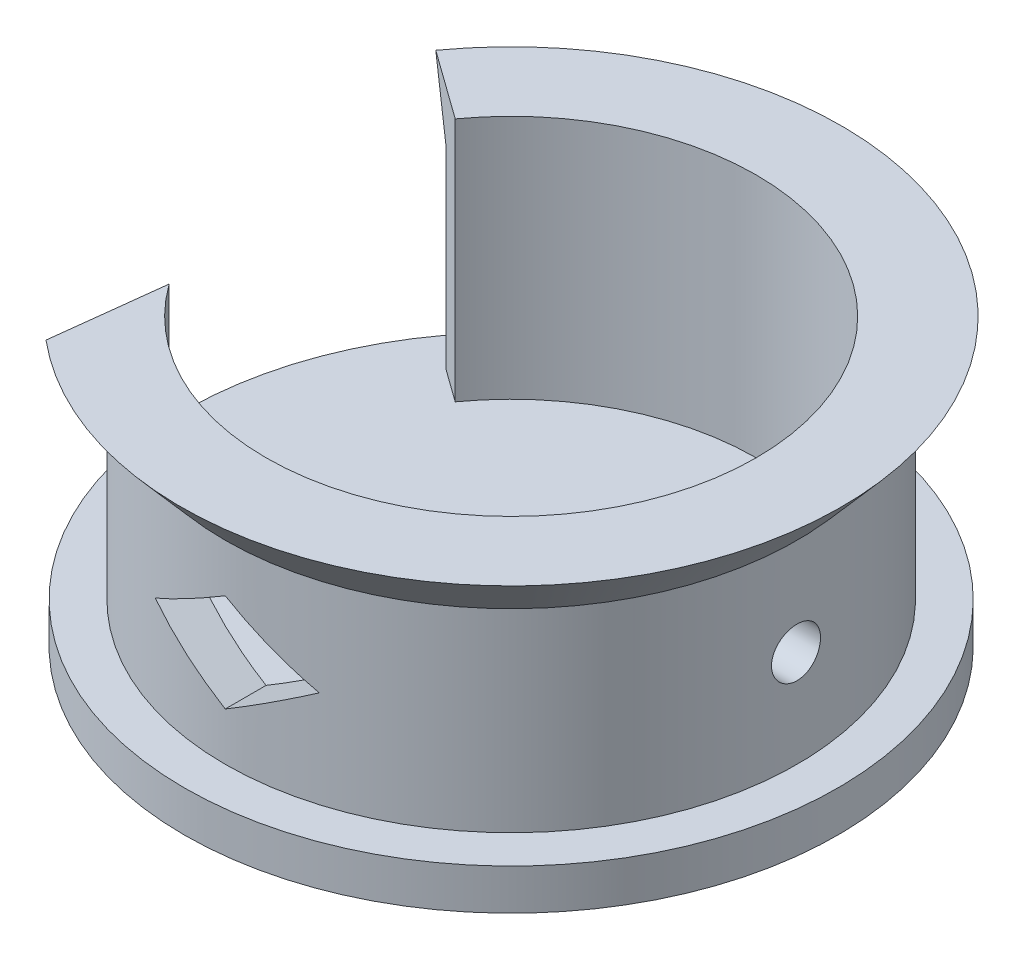
ISO-10303-21;
HEADER;
FILE_DESCRIPTION(('STEP AP214'),'2;1');
FILE_NAME('part.step','',(''),(''),'','','');
FILE_SCHEMA(('AUTOMOTIVE_DESIGN { 1 0 10303 214 1 1 1 1 }'));
ENDSEC;
DATA;
#1=APPLICATION_CONTEXT('core data for automotive mechanical design processes');
#2=APPLICATION_PROTOCOL_DEFINITION('international standard','automotive_design',2000,#1);
#3=PRODUCT_CONTEXT('',#1,'mechanical');
#4=PRODUCT('Part','Part','',(#3));
#5=PRODUCT_RELATED_PRODUCT_CATEGORY('part','',(#4));
#6=PRODUCT_DEFINITION_FORMATION('','',#4);
#7=PRODUCT_DEFINITION_CONTEXT('part definition',#1,'design');
#8=PRODUCT_DEFINITION('design','',#6,#7);
#9=PRODUCT_DEFINITION_SHAPE('','',#8);
#10=(LENGTH_UNIT() NAMED_UNIT(*) SI_UNIT(.MILLI.,.METRE.));
#11=(NAMED_UNIT(*) PLANE_ANGLE_UNIT() SI_UNIT($,.RADIAN.));
#12=(NAMED_UNIT(*) SI_UNIT($,.STERADIAN.) SOLID_ANGLE_UNIT());
#13=UNCERTAINTY_MEASURE_WITH_UNIT(LENGTH_MEASURE(1.E-05),#10,'distance_accuracy_value','');
#14=(GEOMETRIC_REPRESENTATION_CONTEXT(3) GLOBAL_UNCERTAINTY_ASSIGNED_CONTEXT((#13)) GLOBAL_UNIT_ASSIGNED_CONTEXT((#10,
#11,#12)) REPRESENTATION_CONTEXT('',''));
#15=CARTESIAN_POINT('',(0.,0.,0.));
#16=DIRECTION('',(0.,0.,1.));
#17=DIRECTION('',(1.,0.,0.));
#18=AXIS2_PLACEMENT_3D('',#15,#16,#17);
#19=CARTESIAN_POINT('',(0.,5.75,0.));
#20=DIRECTION('',(0.,-1.,0.));
#21=DIRECTION('',(0.,0.,-1.));
#22=AXIS2_PLACEMENT_3D('',#19,#20,#21);
#23=CYLINDRICAL_SURFACE('',#22,6.);
#24=CARTESIAN_POINT('',(0.,1.,0.));
#25=DIRECTION('',(0.,1.,0.));
#26=DIRECTION('',(0.,0.,1.));
#27=AXIS2_PLACEMENT_3D('',#24,#25,#26);
#28=CIRCLE('',#27,6.);
#29=CARTESIAN_POINT('',(-4.87186168856094,1.00000000000002,-3.50213701724137));
#30=VERTEX_POINT('',#29);
#31=CARTESIAN_POINT('',(-4.87186168856094,1.00000000000002,3.50213701724137));
#32=VERTEX_POINT('',#31);
#33=EDGE_CURVE('E140',#30,#32,#28,.F.);
#34=ORIENTED_EDGE('',*,*,#33,.T.);
#35=DIRECTION('',(0.,1.,0.));
#36=VECTOR('',#35,1.);
#37=CARTESIAN_POINT('',(-4.87186168856094,1.00000000000002,3.50213701724137));
#38=LINE('',#37,#36);
#39=CARTESIAN_POINT('',(-4.87186168856093,7.00000000000002,3.50213701724137));
#40=VERTEX_POINT('',#39);
#41=EDGE_CURVE('E144',#32,#40,#38,.T.);
#42=ORIENTED_EDGE('',*,*,#41,.T.);
#43=CARTESIAN_POINT('',(0.,7.00000000000001,0.));
#44=DIRECTION('',(0.,-1.,0.));
#45=DIRECTION('',(1.,0.,0.));
#46=AXIS2_PLACEMENT_3D('',#43,#44,#45);
#47=CIRCLE('',#46,6.);
#48=CARTESIAN_POINT('',(-4.87186168856093,7.00000000000002,-3.50213701724137));
#49=VERTEX_POINT('',#48);
#50=EDGE_CURVE('E142',#49,#40,#47,.T.);
#51=ORIENTED_EDGE('',*,*,#50,.F.);
#52=DIRECTION('',(0.,1.,0.));
#53=VECTOR('',#52,1.);
#54=CARTESIAN_POINT('',(-4.87186168856094,1.00000000000002,-3.50213701724137));
#55=LINE('',#54,#53);
#56=EDGE_CURVE('E70',#30,#49,#55,.T.);
#57=ORIENTED_EDGE('',*,*,#56,.F.);
#58=EDGE_LOOP('',(#34,#42,#51,#57));
#59=FACE_BOUND('',#58,.T.);
#60=CARTESIAN_POINT('',(0.,4.575,0.));
#61=DIRECTION('',(-0.512699186120159,0.858568310940793,0.));
#62=DIRECTION('',(-0.858568310940793,-0.512699186120159,0.));
#63=AXIS2_PLACEMENT_3D('',#60,#61,#62);
#64=ELLIPSE('',#63,6.98837812150949,6.);
#65=CARTESIAN_POINT('',(-2.00952527528977,3.375,5.65347752874031));
#66=VERTEX_POINT('',#65);
#67=CARTESIAN_POINT('',(0.,4.575,6.));
#68=VERTEX_POINT('',#67);
#69=EDGE_CURVE('E198',#66,#68,#64,.T.);
#70=ORIENTED_EDGE('',*,*,#69,.F.);
#71=CARTESIAN_POINT('',(0.,2.175,0.));
#72=DIRECTION('',(0.512699186120159,0.858568310940793,0.));
#73=DIRECTION('',(0.858568310940793,-0.512699186120159,0.));
#74=AXIS2_PLACEMENT_3D('',#71,#72,#73);
#75=ELLIPSE('',#74,6.98837812150949,6.);
#76=CARTESIAN_POINT('',(0.,2.175,6.));
#77=VERTEX_POINT('',#76);
#78=EDGE_CURVE('E208',#66,#77,#75,.T.);
#79=ORIENTED_EDGE('',*,*,#78,.T.);
#80=CARTESIAN_POINT('',(0.,2.175,0.));
#81=DIRECTION('',(-0.512457658614343,0.858712494451726,0.));
#82=DIRECTION('',(-0.858712494451726,-0.512457658614343,0.));
#83=AXIS2_PLACEMENT_3D('',#80,#81,#82);
#84=ELLIPSE('',#83,6.98720472657255,6.);
#85=CARTESIAN_POINT('',(2.00781679805383,3.3732137233419,5.65408451523789));
#86=VERTEX_POINT('',#85);
#87=EDGE_CURVE('E204',#77,#86,#84,.T.);
#88=ORIENTED_EDGE('',*,*,#87,.T.);
#89=CARTESIAN_POINT('',(0.,4.575,0.));
#90=DIRECTION('',(0.513583008999661,0.858039913329709,0.));
#91=DIRECTION('',(0.858039913329709,-0.513583008999661,0.));
#92=AXIS2_PLACEMENT_3D('',#89,#90,#91);
#93=ELLIPSE('',#92,6.99268170022115,6.);
#94=EDGE_CURVE('E201',#68,#86,#93,.T.);
#95=ORIENTED_EDGE('',*,*,#94,.F.);
#96=EDGE_LOOP('',(#70,#79,#88,#95));
#97=FACE_BOUND('',#96,.T.);
#98=CARTESIAN_POINT('',(5.96992462263972,3.375,0.6));
#99=CARTESIAN_POINT('',(5.96992501678142,3.34138826149584,0.599998544036107));
#100=CARTESIAN_POINT('',(5.97021154196531,3.3077542989529,0.597166115389485));
#101=CARTESIAN_POINT('',(5.97132652534872,3.24141888822388,0.585909788858137));
#102=CARTESIAN_POINT('',(5.97215558076732,3.20871850917751,0.577479728931861));
#103=CARTESIAN_POINT('',(5.97426079828433,3.14522050846926,0.555276069641356));
#104=CARTESIAN_POINT('',(5.97553668928074,3.11442174636514,0.541505709776339));
#105=CARTESIAN_POINT('',(5.97839148343092,3.05557932462495,0.50901856043466));
#106=CARTESIAN_POINT('',(5.97997032638597,3.02753511930977,0.490302753375555));
#107=CARTESIAN_POINT('',(5.98325956025939,2.9748892418055,0.448382857199222));
#108=CARTESIAN_POINT('',(5.9849703600316,2.95029899429773,0.425164450864955));
#109=CARTESIAN_POINT('',(5.98832703141431,2.90535743459786,0.374929029191738));
#110=CARTESIAN_POINT('',(5.98997290005128,2.88500631635621,0.347911840143941));
#111=CARTESIAN_POINT('',(5.99301829893363,2.84908124579571,0.290775816990592));
#112=CARTESIAN_POINT('',(5.99441730536788,2.8335174007238,0.260650597517741));
#113=CARTESIAN_POINT('',(5.99680690125462,2.80767334011079,0.198197990572506));
#114=CARTESIAN_POINT('',(5.99779750066238,2.79739299577832,0.165870656800931));
#115=CARTESIAN_POINT('',(5.99925579942616,2.78244125438805,0.100046869645769));
#116=CARTESIAN_POINT('',(5.9997252470569,2.77775110035003,0.0665547162189482));
#117=CARTESIAN_POINT('',(6.00009429359215,2.77405483851977,-0.000744444413366362));
#118=CARTESIAN_POINT('',(5.99999390727164,2.77504858335224,-0.0345514434326772));
#119=CARTESIAN_POINT('',(5.99923602786711,2.78267668359009,-0.101393306438736));
#120=CARTESIAN_POINT('',(5.99858052691028,2.78929086933833,-0.134430497960988));
#121=CARTESIAN_POINT('',(5.99678837558958,2.80794067736797,-0.19892350770272));
#122=CARTESIAN_POINT('',(5.99565171897572,2.81997637007254,-0.230379305374637));
#123=CARTESIAN_POINT('',(5.99302162490349,2.84914965795266,-0.290880188807752));
#124=CARTESIAN_POINT('',(5.99152756419455,2.86629617851809,-0.31992094258899));
#125=CARTESIAN_POINT('',(5.98835030711644,2.90519791400182,-0.374720107904516));
#126=CARTESIAN_POINT('',(5.98666710520087,2.92695326408711,-0.400478423136497));
#127=CARTESIAN_POINT('',(5.98329176080711,2.97456853770819,-0.448099663093614));
#128=CARTESIAN_POINT('',(5.98159961143817,3.00044600684495,-0.469945047714207));
#129=CARTESIAN_POINT('',(5.97840443956933,3.05551011912647,-0.508984521214751));
#130=CARTESIAN_POINT('',(5.97690141734379,3.08469676707129,-0.526178603347734));
#131=CARTESIAN_POINT('',(5.9742545370849,3.14556421511988,-0.555427310743938));
#132=CARTESIAN_POINT('',(5.97311075479533,3.17724553945373,-0.567480852343776));
#133=CARTESIAN_POINT('',(5.97131341122563,3.24219636276881,-0.586092441382554));
#134=CARTESIAN_POINT('',(5.97065983501061,3.27546581333247,-0.59265065624582));
#135=CARTESIAN_POINT('',(5.9699194831645,3.34249450771771,-0.600062865235176));
#136=CARTESIAN_POINT('',(5.96983026928562,3.3762510121589,-0.600941397988327));
#137=CARTESIAN_POINT('',(5.97022230812863,3.44343075949372,-0.597033748122817));
#138=CARTESIAN_POINT('',(5.97070355314237,3.47685400688422,-0.592247642045852));
#139=CARTESIAN_POINT('',(5.97218006653441,3.54234694936701,-0.577167104704512));
#140=CARTESIAN_POINT('',(5.97317425200807,3.5744193426568,-0.566884276313345));
#141=CARTESIAN_POINT('',(5.97556374623277,3.63638403103818,-0.541114031805564));
#142=CARTESIAN_POINT('',(5.97695906417202,3.66627627617231,-0.525626496470153));
#143=CARTESIAN_POINT('',(5.97999950613428,3.72314398441727,-0.48982500085393));
#144=CARTESIAN_POINT('',(5.98164546488803,3.75010916517975,-0.469494779904414));
#145=CARTESIAN_POINT('',(5.98499899575112,3.80025303196444,-0.424608320070704));
#146=CARTESIAN_POINT('',(5.9867065693852,3.82343162420405,-0.400051976548881));
#147=CARTESIAN_POINT('',(5.98999828709581,3.86542898003886,-0.347303882535884));
#148=CARTESIAN_POINT('',(5.99158196433285,3.88423173575173,-0.319099353581671));
#149=CARTESIAN_POINT('',(5.99444065263978,3.91683352110385,-0.259918630450278));
#150=CARTESIAN_POINT('',(5.99571566793895,3.93063261930426,-0.228942474257775));
#151=CARTESIAN_POINT('',(5.99781126248403,3.9528082605932,-0.165153675859689));
#152=CARTESIAN_POINT('',(5.99863265163389,3.96119447239513,-0.132344422589975));
#153=CARTESIAN_POINT('',(5.99973176768189,3.97233784174791,-0.0657748883902072));
#154=CARTESIAN_POINT('',(6.00000950985938,3.97509515750042,-0.0320146342153302));
#155=CARTESIAN_POINT('',(5.99999002987962,3.97490024013603,0.0353413344454483));
#156=CARTESIAN_POINT('',(5.99969531026002,3.97197285789801,0.0689371243347171));
#157=CARTESIAN_POINT('',(5.99856896146555,3.96054375260581,0.135157133013818));
#158=CARTESIAN_POINT('',(5.99773733186924,3.95204202517622,0.16778135104102));
#159=CARTESIAN_POINT('',(5.99563034288377,3.92971244556424,0.231131945260646));
#160=CARTESIAN_POINT('',(5.99435504401949,3.9158853198395,0.261858579646517));
#161=CARTESIAN_POINT('',(5.99150287449778,3.88330009864981,0.320558760092878));
#162=CARTESIAN_POINT('',(5.98992600560493,3.86454203203733,0.348532322261136));
#163=CARTESIAN_POINT('',(5.98663910801433,3.82253422858575,0.401059634656163));
#164=CARTESIAN_POINT('',(5.9849285487642,3.79926599025312,0.425598555731604));
#165=CARTESIAN_POINT('',(5.98157154461795,3.74893478907273,0.470434655635885));
#166=CARTESIAN_POINT('',(5.97992511520666,3.72187091689855,0.490730815108709));
#167=CARTESIAN_POINT('',(5.97687830046361,3.66464139484805,0.526545984254432));
#168=CARTESIAN_POINT('',(5.97547855155184,3.63446803120557,0.542052712796901));
#169=CARTESIAN_POINT('',(5.97309116857477,3.57195102525226,0.567758824859261));
#170=CARTESIAN_POINT('',(5.97210306992016,3.53960987764457,0.577964194733915));
#171=CARTESIAN_POINT('',(5.97090004522887,3.48507135546053,0.590233013000118));
#172=CARTESIAN_POINT('',(5.97053599161417,3.46322264921614,0.593890627438935));
#173=CARTESIAN_POINT('',(5.97004815106598,3.41925250617447,0.598774595163068));
#174=CARTESIAN_POINT('',(5.96992436312391,3.39713107052244,0.600000958654358));
#175=CARTESIAN_POINT('',(5.96992462263972,3.375,0.6));
#176=B_SPLINE_CURVE_WITH_KNOTS('',3,(#98,#99,#100,#101,#102,#103,#104,#105,#106,#107,#108,#109,
#110,#111,#112,#113,#114,#115,#116,#117,#118,#119,#120,#121,#122,#123,#124,#125,#126,#127,#128,
#129,#130,#131,#132,#133,#134,#135,#136,#137,#138,#139,#140,#141,#142,#143,#144,#145,#146,#147,
#148,#149,#150,#151,#152,#153,#154,#155,#156,#157,#158,#159,#160,#161,#162,#163,#164,#165,#166,
#167,#168,#169,#170,#171,#172,#173,#174,#175),.UNSPECIFIED.,.T.,.F.,(4,2,2,2,2,2,2,2,2,2,2,2,2,
2,2,2,2,2,2,2,2,2,2,2,2,2,2,2,2,2,2,2,2,2,2,2,2,2,4),(0.,0.100754396661877,0.201619891093062,
0.302424294598484,0.403208688252789,0.504318969179551,0.605433875131518,0.70676081982775,
0.808085294446769,0.909068825390698,1.01004973798939,1.11066979091197,1.21129115088585,
1.31208927279848,1.41289035131117,1.51413255051001,1.61537489656538,1.7166385747076,
1.8178991675702,1.91872197784659,2.01954342580122,2.12015288822716,2.22076465536628,
2.32171913887031,2.42267612233922,2.52399682090871,2.62531613110803,2.72645395616617,
2.82758893867889,2.9282828008109,3.02897674197995,3.12965695197148,3.23033657286479,
3.33143829022793,3.43256427020715,3.53394744642286,3.635215889364,3.70155616563628,
3.76789616342289),.UNSPECIFIED.);
#177=CARTESIAN_POINT('',(5.96992462263972,3.375,0.6));
#178=VERTEX_POINT('',#177);
#179=EDGE_CURVE('E275',#178,#178,#176,.T.);
#180=ORIENTED_EDGE('',*,*,#179,.T.);
#181=EDGE_LOOP('',(#180));
#182=FACE_BOUND('',#181,.T.);
#183=ADVANCED_FACE('F47',(#59,#97,#182),#23,.F.);
#184=CARTESIAN_POINT('',(0.,5.75,0.));
#185=DIRECTION('',(0.,-1.,0.));
#186=DIRECTION('',(0.,0.,-1.));
#187=AXIS2_PLACEMENT_3D('',#184,#185,#186);
#188=CYLINDRICAL_SURFACE('',#187,7.);
#189=CARTESIAN_POINT('',(0.,2.175,0.));
#190=DIRECTION('',(0.512699186120159,0.858568310940793,0.));
#191=DIRECTION('',(0.858568310940793,-0.512699186120159,0.));
#192=AXIS2_PLACEMENT_3D('',#189,#190,#191);
#193=ELLIPSE('',#192,8.15310780842774,7.);
#194=CARTESIAN_POINT('',(-2.00952527528977,3.375,6.70535667716279));
#195=VERTEX_POINT('',#194);
#196=CARTESIAN_POINT('',(0.,2.175,7.));
#197=VERTEX_POINT('',#196);
#198=EDGE_CURVE('E11',#195,#197,#193,.T.);
#199=ORIENTED_EDGE('',*,*,#198,.F.);
#200=CARTESIAN_POINT('',(0.,4.575,0.));
#201=DIRECTION('',(-0.512699186120159,0.858568310940793,0.));
#202=DIRECTION('',(-0.858568310940793,-0.512699186120159,0.));
#203=AXIS2_PLACEMENT_3D('',#200,#201,#202);
#204=ELLIPSE('',#203,8.15310780842774,7.);
#205=CARTESIAN_POINT('',(0.,4.575,7.));
#206=VERTEX_POINT('',#205);
#207=EDGE_CURVE('E150',#195,#206,#204,.T.);
#208=ORIENTED_EDGE('',*,*,#207,.T.);
#209=CARTESIAN_POINT('',(0.,4.575,0.));
#210=DIRECTION('',(0.513583008999661,0.858039913329709,0.));
#211=DIRECTION('',(0.858039913329709,-0.513583008999661,0.));
#212=AXIS2_PLACEMENT_3D('',#209,#210,#211);
#213=ELLIPSE('',#212,8.15812865025801,7.);
#214=CARTESIAN_POINT('',(2.00781679805383,3.3732137233419,6.70586845273995));
#215=VERTEX_POINT('',#214);
#216=EDGE_CURVE('E156',#206,#215,#213,.T.);
#217=ORIENTED_EDGE('',*,*,#216,.T.);
#218=CARTESIAN_POINT('',(0.,2.175,0.));
#219=DIRECTION('',(-0.512457658614343,0.858712494451726,0.));
#220=DIRECTION('',(-0.858712494451726,-0.512457658614343,0.));
#221=AXIS2_PLACEMENT_3D('',#218,#219,#220);
#222=ELLIPSE('',#221,8.15173884766797,7.);
#223=EDGE_CURVE('E62',#197,#215,#222,.T.);
#224=ORIENTED_EDGE('',*,*,#223,.F.);
#225=EDGE_LOOP('',(#199,#208,#217,#224));
#226=FACE_BOUND('',#225,.T.);
#227=DIRECTION('',(0.,-1.,0.));
#228=VECTOR('',#227,1.);
#229=CARTESIAN_POINT('',(-5.03344359826685,5.75000000000001,4.86461155109701));
#230=LINE('',#229,#228);
#231=CARTESIAN_POINT('',(-5.03344359826686,1.00000000000002,4.864611551097));
#232=VERTEX_POINT('',#231);
#233=CARTESIAN_POINT('',(-5.03344359826685,5.75000000000001,4.864611551097));
#234=VERTEX_POINT('',#233);
#235=EDGE_CURVE('E223',#232,#234,#230,.F.);
#236=ORIENTED_EDGE('',*,*,#235,.F.);
#237=CARTESIAN_POINT('',(0.,1.,0.));
#238=DIRECTION('',(0.,1.,0.));
#239=DIRECTION('',(0.,0.,1.));
#240=AXIS2_PLACEMENT_3D('',#237,#238,#239);
#241=CIRCLE('',#240,7.);
#242=CARTESIAN_POINT('',(-5.68383863665442,1.00000000000002,-4.08582652011493));
#243=VERTEX_POINT('',#242);
#244=EDGE_CURVE('E212',#232,#243,#241,.T.);
#245=ORIENTED_EDGE('',*,*,#244,.T.);
#246=DIRECTION('',(0.,-1.,0.));
#247=VECTOR('',#246,1.);
#248=CARTESIAN_POINT('',(-5.68383863665442,5.75,-4.08582652011493));
#249=LINE('',#248,#247);
#250=CARTESIAN_POINT('',(-5.6838386366544,5.75,-4.08582652011492));
#251=VERTEX_POINT('',#250);
#252=EDGE_CURVE('E126',#243,#251,#249,.F.);
#253=ORIENTED_EDGE('',*,*,#252,.T.);
#254=CARTESIAN_POINT('',(0.,5.75,0.));
#255=DIRECTION('',(0.,1.,0.));
#256=DIRECTION('',(0.,0.,1.));
#257=AXIS2_PLACEMENT_3D('',#254,#255,#256);
#258=CIRCLE('',#257,7.);
#259=EDGE_CURVE('E213',#234,#251,#258,.T.);
#260=ORIENTED_EDGE('',*,*,#259,.F.);
#261=EDGE_LOOP('',(#236,#245,#253,#260));
#262=FACE_BOUND('',#261,.T.);
#263=CARTESIAN_POINT('',(6.97423830966508,3.375,0.6));
#264=CARTESIAN_POINT('',(6.97423865050198,3.34136422044062,0.599998532191382));
#265=CARTESIAN_POINT('',(6.97448426067236,3.3077056288827,0.597162069016927));
#266=CARTESIAN_POINT('',(6.97544013724554,3.2413199857784,0.58588877543727));
#267=CARTESIAN_POINT('',(6.97615092822969,3.20859402948925,0.577445622246808));
#268=CARTESIAN_POINT('',(6.97795607392502,3.14504473670388,0.555205150599323));
#269=CARTESIAN_POINT('',(6.97905020916325,3.11422032338354,0.541410895281653));
#270=CARTESIAN_POINT('',(6.98149848792009,3.05533164026386,0.508865295562401));
#271=CARTESIAN_POINT('',(6.98285257635673,3.02726678763778,0.490115000988515));
#272=CARTESIAN_POINT('',(6.98567230566408,2.97461063579823,0.448134761409391));
#273=CARTESIAN_POINT('',(6.98713820670956,2.95002784330141,0.424894162861934));
#274=CARTESIAN_POINT('',(6.99001401138104,2.90510673285285,0.374615607691181));
#275=CARTESIAN_POINT('',(6.99142391254333,2.88476860147826,0.347577484232283));
#276=CARTESIAN_POINT('',(6.99403134119404,2.84888566072442,0.290420434095021));
#277=CARTESIAN_POINT('',(6.99522854016106,2.83334823921848,0.260296853079579));
#278=CARTESIAN_POINT('',(6.99727286484041,2.80755502527813,0.197856430546741));
#279=CARTESIAN_POINT('',(6.99811999699635,2.79729913562669,0.165539629412293));
#280=CARTESIAN_POINT('',(6.99936691977831,2.78238467511817,0.0997150108437553));
#281=CARTESIAN_POINT('',(6.99976781301671,2.77771230581927,0.0662103410602788));
#282=CARTESIAN_POINT('',(7.00008082663033,2.77405485661757,-0.00110990337436471));
#283=CARTESIAN_POINT('',(6.99999295656777,2.77506966545003,-0.0349254719301429));
#284=CARTESIAN_POINT('',(6.99933925293461,2.78274649220578,-0.101814038368266));
#285=CARTESIAN_POINT('',(6.99877467522766,2.78939367207671,-0.134888753201486));
#286=CARTESIAN_POINT('',(6.99723249568234,2.8081234742478,-0.199451301211187));
#287=CARTESIAN_POINT('',(6.99625488972166,2.82020615079813,-0.2309391185458));
#288=CARTESIAN_POINT('',(6.99399446507932,2.84948046542979,-0.291481205340836));
#289=CARTESIAN_POINT('',(6.99271125046074,2.86667873837216,-0.32053225122166));
#290=CARTESIAN_POINT('',(6.98998378570925,2.90569123243934,-0.375340959953433));
#291=CARTESIAN_POINT('',(6.98853953211796,2.92750555270436,-0.40109855205084));
#292=CARTESIAN_POINT('',(6.98564678702227,2.97521451768241,-0.448675966498289));
#293=CARTESIAN_POINT('',(6.98419829682428,3.00112205764632,-0.470482860093789));
#294=CARTESIAN_POINT('',(6.98146499899432,3.056237132769,-0.509439947528273));
#295=CARTESIAN_POINT('',(6.98018019150891,3.08544467088263,-0.526590137197567));
#296=CARTESIAN_POINT('',(6.97791951064548,3.14633983822835,-0.555746550258746));
#297=CARTESIAN_POINT('',(6.97694367857873,3.17802779839721,-0.567752085865083));
#298=CARTESIAN_POINT('',(6.97541224928428,3.24297989772501,-0.586268738900132));
#299=CARTESIAN_POINT('',(6.97485664270227,3.27624400178114,-0.592779978633399));
#300=CARTESIAN_POINT('',(6.97423010563689,3.34329096190162,-0.600106807995548));
#301=CARTESIAN_POINT('',(6.97415764029966,3.37707183316524,-0.600940434574179));
#302=CARTESIAN_POINT('',(6.97450153962461,3.44429283370313,-0.596935637614893));
#303=CARTESIAN_POINT('',(6.9749178994589,3.47773296633941,-0.59209727009639));
#304=CARTESIAN_POINT('',(6.97619113692522,3.54327136103621,-0.576900872354879));
#305=CARTESIAN_POINT('',(6.97704734153463,3.57537159242294,-0.56655127418532));
#306=CARTESIAN_POINT('',(6.97910323965732,3.63738000777893,-0.540634779065117));
#307=CARTESIAN_POINT('',(6.98030293899553,3.6672881545644,-0.525067793638129));
#308=CARTESIAN_POINT('',(6.98291437122899,3.72414591360165,-0.489112832938145));
#309=CARTESIAN_POINT('',(6.98432662911675,3.75108790627859,-0.468712847076803));
#310=CARTESIAN_POINT('',(6.98720228515176,3.80117152897648,-0.423688295092805));
#311=CARTESIAN_POINT('',(6.98866568422922,3.8243130898271,-0.399063652095302));
#312=CARTESIAN_POINT('',(6.99148331285524,3.86620059457686,-0.346210805462419));
#313=CARTESIAN_POINT('',(6.99283724504033,3.8849348130874,-0.317973291060347));
#314=CARTESIAN_POINT('',(6.99527909640083,3.91739535434427,-0.258742599750699));
#315=CARTESIAN_POINT('',(6.99636701836653,3.93112172962063,-0.227749451752719));
#316=CARTESIAN_POINT('',(6.99815290478386,3.95315684174168,-0.163929146903477));
#317=CARTESIAN_POINT('',(6.99885138935736,3.96147280707219,-0.131104500958708));
#318=CARTESIAN_POINT('',(6.99978181554919,3.97247466027645,-0.0645185921587533));
#319=CARTESIAN_POINT('',(7.00001376656141,3.97516066151237,-0.0307573481763139));
#320=CARTESIAN_POINT('',(6.99998500301097,3.97482498357256,0.0366278741621123));
#321=CARTESIAN_POINT('',(6.99972586492781,3.97182156840343,0.0702519456792062));
#322=CARTESIAN_POINT('',(6.99874715617902,3.96023042817147,0.136516227387567));
#323=CARTESIAN_POINT('',(6.99802758491834,3.95164269589165,0.169156436307264));
#324=CARTESIAN_POINT('',(6.99620873029123,3.92913139562464,0.232527461746223));
#325=CARTESIAN_POINT('',(6.99510947231955,3.91520818448561,0.263258405801466));
#326=CARTESIAN_POINT('',(6.99265416475346,3.88242322307355,0.321949620369786));
#327=CARTESIAN_POINT('',(6.99129811887973,3.86356154435394,0.349909931018465));
#328=CARTESIAN_POINT('',(6.98847621508332,3.82136648769183,0.402359692036196));
#329=CARTESIAN_POINT('',(6.98701003323353,3.79801957722547,0.426838238244782));
#330=CARTESIAN_POINT('',(6.98413586298733,3.74754164145598,0.471539381309728));
#331=CARTESIAN_POINT('',(6.98272788875213,3.72040970224384,0.491760947335169));
#332=CARTESIAN_POINT('',(6.98012656413373,3.66307626699873,0.527403187095964));
#333=CARTESIAN_POINT('',(6.97893363983408,3.63286885870416,0.54281437313527));
#334=CARTESIAN_POINT('',(6.97690266150886,3.5703053554479,0.568326093206933));
#335=CARTESIAN_POINT('',(6.97606420072176,3.53795177292674,0.578432717678778));
#336=CARTESIAN_POINT('',(6.9750521697075,3.48367358438416,0.590481445162075));
#337=CARTESIAN_POINT('',(6.97474838045614,3.46209780857621,0.594046140889055));
#338=CARTESIAN_POINT('',(6.974341340033,3.41868456261859,0.598805891588021));
#339=CARTESIAN_POINT('',(6.97423808828488,3.39684709322121,0.600000953370254));
#340=CARTESIAN_POINT('',(6.97423830966508,3.375,0.6));
#341=B_SPLINE_CURVE_WITH_KNOTS('',3,(#263,#264,#265,#266,#267,#268,#269,#270,#271,#272,#273,
#274,#275,#276,#277,#278,#279,#280,#281,#282,#283,#284,#285,#286,#287,#288,#289,#290,#291,#292,
#293,#294,#295,#296,#297,#298,#299,#300,#301,#302,#303,#304,#305,#306,#307,#308,#309,#310,#311,
#312,#313,#314,#315,#316,#317,#318,#319,#320,#321,#322,#323,#324,#325,#326,#327,#328,#329,#330,
#331,#332,#333,#334,#335,#336,#337,#338,#339,#340),.UNSPECIFIED.,.T.,.F.,(4,2,2,2,2,2,2,2,2,2,2,
2,2,2,2,2,2,2,2,2,2,2,2,2,2,2,2,2,2,2,2,2,2,2,2,2,2,2,4),(0.,0.100827569030982,0.20176903702508,
0.302652808007393,0.403515226088538,0.504619952546395,0.605729122200141,0.706993123841379,
0.808255261451726,0.909266631014318,1.01027602438332,1.11102014057921,1.21176526229627,
1.31264162312537,1.41352015072578,1.51472306642927,1.61592607275123,1.7171426046213,
1.81835688332375,1.91924946840776,2.02014105703519,2.12087872554718,2.22161810245286,
2.32261050463772,2.42360474474666,2.52486470809704,2.62612360924548,2.72724694583426,
2.82836824623393,2.92916547984925,3.02996284373197,3.13075346724919,3.23154263049244,
3.33264080406711,3.43376343055138,3.53508426285377,3.63628850761122,3.70177816355235,
3.76726763127819),.UNSPECIFIED.);
#342=CARTESIAN_POINT('',(6.97423830966508,3.375,0.6));
#343=VERTEX_POINT('',#342);
#344=EDGE_CURVE('E51',#343,#343,#341,.T.);
#345=ORIENTED_EDGE('',*,*,#344,.F.);
#346=EDGE_LOOP('',(#345));
#347=FACE_BOUND('',#346,.T.);
#348=ADVANCED_FACE('F220',(#226,#262,#347),#188,.T.);
#349=CARTESIAN_POINT('',(0.,5.75000000000001,0.));
#350=DIRECTION('',(0.,1.,0.));
#351=DIRECTION('',(-1.,0.,0.));
#352=AXIS2_PLACEMENT_3D('',#349,#350,#351);
#353=CONICAL_SURFACE('',#352,7.,0.714729516755305);
#354=CARTESIAN_POINT('',(0.,7.00000000000001,0.));
#355=DIRECTION('',(0.,-1.,0.));
#356=DIRECTION('',(1.,0.,0.));
#357=AXIS2_PLACEMENT_3D('',#354,#355,#356);
#358=CIRCLE('',#357,8.08473241004738);
#359=CARTESIAN_POINT('',(-6.56461634846278,7.00000000000002,-4.71897344128633));
#360=VERTEX_POINT('',#359);
#361=CARTESIAN_POINT('',(-5.19153456591552,7.00000000000002,6.19765011863165));
#362=VERTEX_POINT('',#361);
#363=EDGE_CURVE('E178',#360,#362,#358,.T.);
#364=ORIENTED_EDGE('',*,*,#363,.T.);
#365=CARTESIAN_POINT('',(-5.19155898957352,7.0002,6.19785606131489));
#366=CARTESIAN_POINT('',(-5.1785956675273,6.89405181640053,6.08854805651235));
#367=CARTESIAN_POINT('',(-5.16558727684558,6.78829854867479,5.97886002854845));
#368=CARTESIAN_POINT('',(-5.13946871893408,6.57772276031978,5.75862578277043));
#369=CARTESIAN_POINT('',(-5.12635856108251,6.47290015579096,5.64807964403439));
#370=CARTESIAN_POINT('',(-5.10002221990802,6.26430522212049,5.42600902839129));
#371=CARTESIAN_POINT('',(-5.08679603436251,6.16053291318029,5.31448453274318));
#372=CARTESIAN_POINT('',(-5.0602103789017,5.95420647364656,5.09031167454926));
#373=CARTESIAN_POINT('',(-5.04685089694052,5.85165245501742,4.97766321043135));
#374=CARTESIAN_POINT('',(-5.03341721718184,5.74980000000004,4.86438910319696));
#375=B_SPLINE_CURVE_WITH_KNOTS('',3,(#365,#366,#367,#368,#369,#370,#371,#372,#373,#374),
.UNSPECIFIED.,.F.,.F.,(4,2,2,2,4),(0.,0.458753046960311,0.917464308484695,1.37618437618866,
1.8349462804219),.UNSPECIFIED.);
#376=EDGE_CURVE('E227',#362,#234,#375,.T.);
#377=ORIENTED_EDGE('',*,*,#376,.T.);
#378=ORIENTED_EDGE('',*,*,#259,.T.);
#379=DIRECTION('',(-0.532180371426501,0.75527054711378,-0.38255777724522));
#380=VECTOR('',#379,1.);
#381=CARTESIAN_POINT('',(0.,-2.31650554454972,0.));
#382=LINE('',#381,#380);
#383=EDGE_CURVE('E290',#360,#251,#382,.F.);
#384=ORIENTED_EDGE('',*,*,#383,.F.);
#385=EDGE_LOOP('',(#364,#377,#378,#384));
#386=FACE_BOUND('',#385,.T.);
#387=ADVANCED_FACE('F240',(#386),#353,.T.);
#388=CARTESIAN_POINT('',(0.,7.00000000000001,0.));
#389=DIRECTION('',(0.,-1.,0.));
#390=DIRECTION('',(1.,0.,0.));
#391=AXIS2_PLACEMENT_3D('',#388,#389,#390);
#392=PLANE('',#391);
#393=DIRECTION('',(-0.11776914523546,0.,0.993041000377381));
#394=VECTOR('',#393,1.);
#395=CARTESIAN_POINT('',(-4.39471756661126,7.00000000000002,-0.521189086024024));
#396=LINE('',#395,#394);
#397=EDGE_CURVE('E133',#40,#362,#396,.T.);
#398=ORIENTED_EDGE('',*,*,#397,.T.);
#399=ORIENTED_EDGE('',*,*,#363,.F.);
#400=DIRECTION('',(-0.811976948093488,0.,-0.583689502873561));
#401=VECTOR('',#400,1.);
#402=CARTESIAN_POINT('',(0.,7.00000000000001,0.));
#403=LINE('',#402,#401);
#404=EDGE_CURVE('E281',#49,#360,#403,.T.);
#405=ORIENTED_EDGE('',*,*,#404,.F.);
#406=ORIENTED_EDGE('',*,*,#50,.T.);
#407=EDGE_LOOP('',(#398,#399,#405,#406));
#408=FACE_BOUND('',#407,.T.);
#409=ADVANCED_FACE('F252',(#408),#392,.F.);
#410=CARTESIAN_POINT('',(0.,1.,0.));
#411=DIRECTION('',(0.,-1.,0.));
#412=DIRECTION('',(0.,0.,-1.));
#413=AXIS2_PLACEMENT_3D('',#410,#411,#412);
#414=CYLINDRICAL_SURFACE('',#413,8.);
#415=CARTESIAN_POINT('',(0.,1.,0.));
#416=DIRECTION('',(0.,1.,0.));
#417=DIRECTION('',(0.,0.,1.));
#418=AXIS2_PLACEMENT_3D('',#415,#416,#417);
#419=CIRCLE('',#418,8.);
#420=CARTESIAN_POINT('',(0.,1.,8.));
#421=VERTEX_POINT('',#420);
#422=EDGE_CURVE('E151',#421,#421,#419,.T.);
#423=ORIENTED_EDGE('',*,*,#422,.F.);
#424=EDGE_LOOP('',(#423));
#425=FACE_BOUND('',#424,.T.);
#426=CARTESIAN_POINT('',(0.,0.,0.));
#427=DIRECTION('',(0.,1.,0.));
#428=DIRECTION('',(0.,0.,1.));
#429=AXIS2_PLACEMENT_3D('',#426,#427,#428);
#430=CIRCLE('',#429,8.);
#431=CARTESIAN_POINT('',(0.,0.,8.));
#432=VERTEX_POINT('',#431);
#433=EDGE_CURVE('E159',#432,#432,#430,.T.);
#434=ORIENTED_EDGE('',*,*,#433,.T.);
#435=EDGE_LOOP('',(#434));
#436=FACE_BOUND('',#435,.T.);
#437=ADVANCED_FACE('F49',(#425,#436),#414,.T.);
#438=CARTESIAN_POINT('',(0.,1.,0.));
#439=DIRECTION('',(0.,1.,0.));
#440=DIRECTION('',(0.,0.,1.));
#441=AXIS2_PLACEMENT_3D('',#438,#439,#440);
#442=PLANE('',#441);
#443=ORIENTED_EDGE('',*,*,#422,.T.);
#444=EDGE_LOOP('',(#443));
#445=FACE_BOUND('',#444,.T.);
#446=ORIENTED_EDGE('',*,*,#244,.F.);
#447=DIRECTION('',(-0.11776914523546,0.,0.993041000377381));
#448=VECTOR('',#447,1.);
#449=CARTESIAN_POINT('',(-4.39471756661127,1.00000000000002,-0.521189086024024));
#450=LINE('',#449,#448);
#451=EDGE_CURVE('E132',#32,#232,#450,.T.);
#452=ORIENTED_EDGE('',*,*,#451,.F.);
#453=ORIENTED_EDGE('',*,*,#33,.F.);
#454=DIRECTION('',(-0.811976948093488,0.,-0.583689502873561));
#455=VECTOR('',#454,1.);
#456=CARTESIAN_POINT('',(0.,1.00000000000001,0.));
#457=LINE('',#456,#455);
#458=EDGE_CURVE('E123',#30,#243,#457,.T.);
#459=ORIENTED_EDGE('',*,*,#458,.T.);
#460=EDGE_LOOP('',(#446,#452,#453,#459));
#461=FACE_BOUND('',#460,.T.);
#462=CARTESIAN_POINT('',(0.,1.,0.));
#463=DIRECTION('',(0.,1.,0.));
#464=DIRECTION('',(0.,0.,1.));
#465=AXIS2_PLACEMENT_3D('',#462,#463,#464);
#466=CIRCLE('',#465,2.4);
#467=CARTESIAN_POINT('',(0.,1.,2.4));
#468=VERTEX_POINT('',#467);
#469=EDGE_CURVE('E170',#468,#468,#466,.T.);
#470=ORIENTED_EDGE('',*,*,#469,.F.);
#471=EDGE_LOOP('',(#470));
#472=FACE_BOUND('',#471,.T.);
#473=ADVANCED_FACE('F147',(#445,#461,#472),#442,.T.);
#474=CARTESIAN_POINT('',(0.,0.,0.));
#475=DIRECTION('',(0.,1.,0.));
#476=DIRECTION('',(0.,0.,1.));
#477=AXIS2_PLACEMENT_3D('',#474,#475,#476);
#478=PLANE('',#477);
#479=CARTESIAN_POINT('',(0.,0.,0.));
#480=DIRECTION('',(0.,1.,0.));
#481=DIRECTION('',(0.,0.,1.));
#482=AXIS2_PLACEMENT_3D('',#479,#480,#481);
#483=CIRCLE('',#482,2.4);
#484=CARTESIAN_POINT('',(0.,0.,2.4));
#485=VERTEX_POINT('',#484);
#486=EDGE_CURVE('E167',#485,#485,#483,.T.);
#487=ORIENTED_EDGE('',*,*,#486,.T.);
#488=EDGE_LOOP('',(#487));
#489=FACE_BOUND('',#488,.T.);
#490=ORIENTED_EDGE('',*,*,#433,.F.);
#491=EDGE_LOOP('',(#490));
#492=FACE_BOUND('',#491,.T.);
#493=ADVANCED_FACE('F380',(#489,#492),#478,.F.);
#494=CARTESIAN_POINT('',(0.957407321489192,1.60327850940001,10.));
#495=DIRECTION('',(0.512699186120159,0.858568310940793,0.));
#496=DIRECTION('',(-0.858568310940793,0.512699186120159,0.));
#497=AXIS2_PLACEMENT_3D('',#494,#495,#496);
#498=PLANE('',#497);
#499=DIRECTION('',(0.,0.,-1.));
#500=VECTOR('',#499,1.);
#501=CARTESIAN_POINT('',(-2.00952527528977,3.375,10.));
#502=LINE('',#501,#500);
#503=EDGE_CURVE('E78',#195,#66,#502,.T.);
#504=ORIENTED_EDGE('',*,*,#503,.F.);
#505=ORIENTED_EDGE('',*,*,#198,.T.);
#506=DIRECTION('',(0.,0.,-1.));
#507=VECTOR('',#506,1.);
#508=CARTESIAN_POINT('',(0.,2.175,10.));
#509=LINE('',#508,#507);
#510=EDGE_CURVE('E194',#197,#77,#509,.T.);
#511=ORIENTED_EDGE('',*,*,#510,.T.);
#512=ORIENTED_EDGE('',*,*,#78,.F.);
#513=EDGE_LOOP('',(#504,#505,#511,#512));
#514=FACE_BOUND('',#513,.T.);
#515=ADVANCED_FACE('F270',(#514),#498,.T.);
#516=CARTESIAN_POINT('',(-0.95711700266691,1.60381704717732,10.));
#517=DIRECTION('',(-0.512457658614343,0.858712494451726,0.));
#518=DIRECTION('',(-0.858712494451726,-0.512457658614343,0.));
#519=AXIS2_PLACEMENT_3D('',#516,#517,#518);
#520=PLANE('',#519);
#521=ORIENTED_EDGE('',*,*,#510,.F.);
#522=ORIENTED_EDGE('',*,*,#223,.T.);
#523=DIRECTION('',(0.,0.,-1.));
#524=VECTOR('',#523,1.);
#525=CARTESIAN_POINT('',(2.00781679805383,3.3732137233419,10.));
#526=LINE('',#525,#524);
#527=EDGE_CURVE('E190',#215,#86,#526,.T.);
#528=ORIENTED_EDGE('',*,*,#527,.T.);
#529=ORIENTED_EDGE('',*,*,#87,.F.);
#530=EDGE_LOOP('',(#521,#522,#528,#529));
#531=FACE_BOUND('',#530,.T.);
#532=ADVANCED_FACE('F364',(#531),#520,.T.);
#533=CARTESIAN_POINT('',(2.01608684642329,3.36826365486586,10.));
#534=DIRECTION('',(0.513583008999661,0.858039913329709,0.));
#535=DIRECTION('',(-0.858039913329709,0.513583008999661,0.));
#536=AXIS2_PLACEMENT_3D('',#533,#534,#535);
#537=PLANE('',#536);
#538=ORIENTED_EDGE('',*,*,#94,.T.);
#539=ORIENTED_EDGE('',*,*,#527,.F.);
#540=ORIENTED_EDGE('',*,*,#216,.F.);
#541=DIRECTION('',(0.,0.,-1.));
#542=VECTOR('',#541,1.);
#543=CARTESIAN_POINT('',(0.,4.575,10.));
#544=LINE('',#543,#542);
#545=EDGE_CURVE('E175',#206,#68,#544,.T.);
#546=ORIENTED_EDGE('',*,*,#545,.T.);
#547=EDGE_LOOP('',(#538,#539,#540,#546));
#548=FACE_BOUND('',#547,.T.);
#549=ADVANCED_FACE('F356',(#548),#537,.F.);
#550=CARTESIAN_POINT('',(-2.01385677968416,3.37241341632415,10.));
#551=DIRECTION('',(-0.512699186120159,0.858568310940793,0.));
#552=DIRECTION('',(-0.858568310940793,-0.512699186120159,0.));
#553=AXIS2_PLACEMENT_3D('',#550,#551,#552);
#554=PLANE('',#553);
#555=ORIENTED_EDGE('',*,*,#69,.T.);
#556=ORIENTED_EDGE('',*,*,#545,.F.);
#557=ORIENTED_EDGE('',*,*,#207,.F.);
#558=ORIENTED_EDGE('',*,*,#503,.T.);
#559=EDGE_LOOP('',(#555,#556,#557,#558));
#560=FACE_BOUND('',#559,.T.);
#561=ADVANCED_FACE('F349',(#560),#554,.F.);
#562=CARTESIAN_POINT('',(0.,-9.,0.));
#563=DIRECTION('',(0.,1.,0.));
#564=DIRECTION('',(0.,0.,1.));
#565=AXIS2_PLACEMENT_3D('',#562,#563,#564);
#566=CYLINDRICAL_SURFACE('',#565,2.4);
#567=ORIENTED_EDGE('',*,*,#469,.T.);
#568=EDGE_LOOP('',(#567));
#569=FACE_BOUND('',#568,.T.);
#570=ORIENTED_EDGE('',*,*,#486,.F.);
#571=EDGE_LOOP('',(#570));
#572=FACE_BOUND('',#571,.T.);
#573=ADVANCED_FACE('F248',(#569,#572),#566,.F.);
#574=CARTESIAN_POINT('',(-4.39471756661127,1.00000000000002,-0.521189086024024));
#575=DIRECTION('',(-0.993041000377381,0.,-0.11776914523546));
#576=DIRECTION('',(-0.11776914523546,0.,0.993041000377381));
#577=AXIS2_PLACEMENT_3D('',#574,#575,#576);
#578=PLANE('',#577);
#579=ORIENTED_EDGE('',*,*,#235,.T.);
#580=ORIENTED_EDGE('',*,*,#376,.F.);
#581=ORIENTED_EDGE('',*,*,#397,.F.);
#582=ORIENTED_EDGE('',*,*,#41,.F.);
#583=ORIENTED_EDGE('',*,*,#451,.T.);
#584=EDGE_LOOP('',(#579,#580,#581,#582,#583));
#585=FACE_BOUND('',#584,.T.);
#586=ADVANCED_FACE('F244',(#585),#578,.T.);
#587=CARTESIAN_POINT('',(0.,1.00000000000001,0.));
#588=DIRECTION('',(0.583689502873561,0.,-0.811976948093488));
#589=DIRECTION('',(-0.811976948093488,0.,-0.583689502873561));
#590=AXIS2_PLACEMENT_3D('',#587,#588,#589);
#591=PLANE('',#590);
#592=ORIENTED_EDGE('',*,*,#458,.F.);
#593=ORIENTED_EDGE('',*,*,#56,.T.);
#594=ORIENTED_EDGE('',*,*,#404,.T.);
#595=ORIENTED_EDGE('',*,*,#383,.T.);
#596=ORIENTED_EDGE('',*,*,#252,.F.);
#597=EDGE_LOOP('',(#592,#593,#594,#595,#596));
#598=FACE_BOUND('',#597,.T.);
#599=ADVANCED_FACE('F124',(#598),#591,.F.);
#600=CARTESIAN_POINT('',(10.,3.375,0.));
#601=DIRECTION('',(-1.,0.,0.));
#602=DIRECTION('',(0.,0.,1.));
#603=AXIS2_PLACEMENT_3D('',#600,#601,#602);
#604=CYLINDRICAL_SURFACE('',#603,0.6);
#605=ORIENTED_EDGE('',*,*,#179,.F.);
#606=EDGE_LOOP('',(#605));
#607=FACE_BOUND('',#606,.T.);
#608=ORIENTED_EDGE('',*,*,#344,.T.);
#609=EDGE_LOOP('',(#608));
#610=FACE_BOUND('',#609,.T.);
#611=ADVANCED_FACE('F249',(#607,#610),#604,.F.);
#612=CLOSED_SHELL('',(#183,#348,#387,#409,#437,#473,#493,#515,#532,#549,#561,#573,#586,#599,#611));
#613=MANIFOLD_SOLID_BREP('B2',#612);
#614=ADVANCED_BREP_SHAPE_REPRESENTATION('',(#18,#613),#14);
#615=SHAPE_DEFINITION_REPRESENTATION(#9,#614);
ENDSEC;
END-ISO-10303-21;
